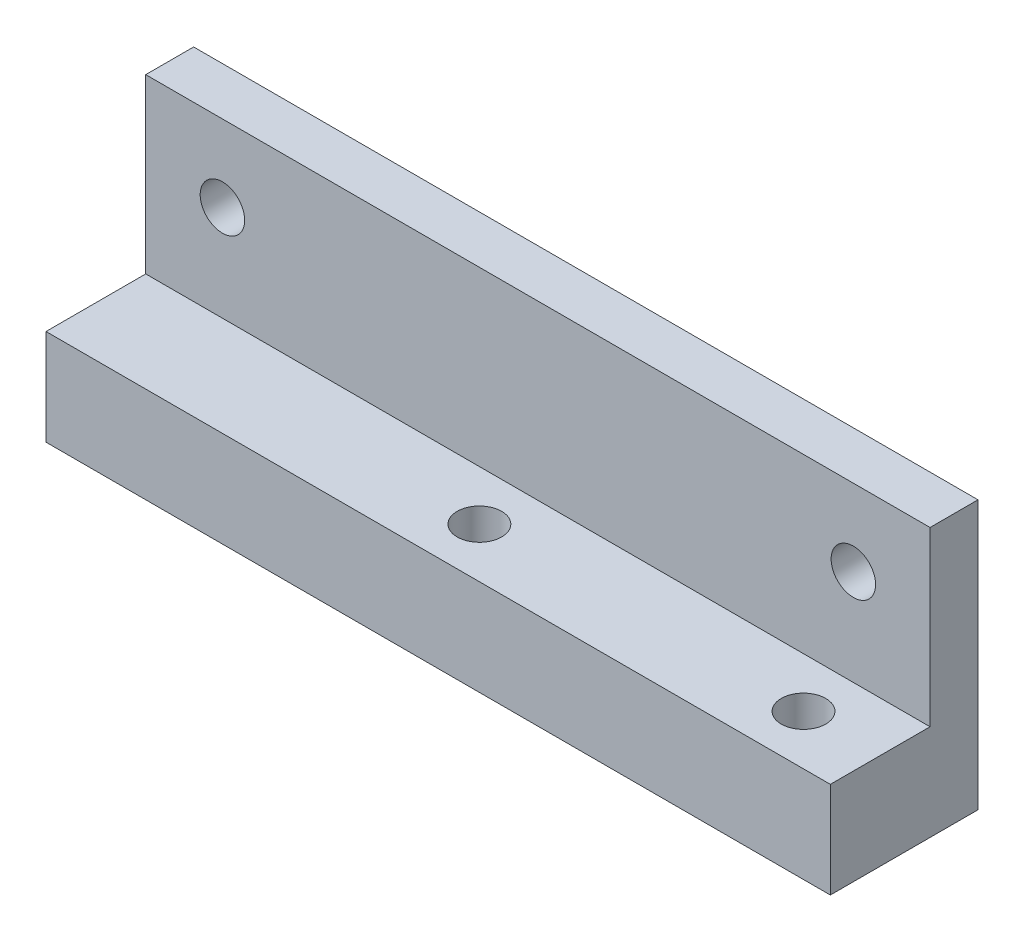
ISO-10303-21;
HEADER;
FILE_DESCRIPTION(('STEP AP214'),'2;1');
FILE_NAME('part.step','',(''),(''),'','','');
FILE_SCHEMA(('AUTOMOTIVE_DESIGN { 1 0 10303 214 1 1 1 1 }'));
ENDSEC;
DATA;
#1=APPLICATION_CONTEXT('core data for automotive mechanical design processes');
#2=APPLICATION_PROTOCOL_DEFINITION('international standard','automotive_design',2000,#1);
#3=PRODUCT_CONTEXT('',#1,'mechanical');
#4=PRODUCT('Part','Part','',(#3));
#5=PRODUCT_RELATED_PRODUCT_CATEGORY('part','',(#4));
#6=PRODUCT_DEFINITION_FORMATION('','',#4);
#7=PRODUCT_DEFINITION_CONTEXT('part definition',#1,'design');
#8=PRODUCT_DEFINITION('design','',#6,#7);
#9=PRODUCT_DEFINITION_SHAPE('','',#8);
#10=(LENGTH_UNIT() NAMED_UNIT(*) SI_UNIT(.MILLI.,.METRE.));
#11=(NAMED_UNIT(*) PLANE_ANGLE_UNIT() SI_UNIT($,.RADIAN.));
#12=(NAMED_UNIT(*) SI_UNIT($,.STERADIAN.) SOLID_ANGLE_UNIT());
#13=UNCERTAINTY_MEASURE_WITH_UNIT(LENGTH_MEASURE(1.E-05),#10,'distance_accuracy_value','');
#14=(GEOMETRIC_REPRESENTATION_CONTEXT(3) GLOBAL_UNCERTAINTY_ASSIGNED_CONTEXT((#13)) GLOBAL_UNIT_ASSIGNED_CONTEXT((#10,
#11,#12)) REPRESENTATION_CONTEXT('',''));
#15=CARTESIAN_POINT('',(0.,0.,0.));
#16=DIRECTION('',(0.,0.,1.));
#17=DIRECTION('',(1.,0.,0.));
#18=AXIS2_PLACEMENT_3D('',#15,#16,#17);
#19=CARTESIAN_POINT('',(0.,6.35,0.));
#20=DIRECTION('',(0.,-1.,0.));
#21=DIRECTION('',(0.,0.,-1.));
#22=AXIS2_PLACEMENT_3D('',#19,#20,#21);
#23=PLANE('',#22);
#24=CARTESIAN_POINT('',(25.4,6.35,-3.302));
#25=DIRECTION('',(0.,1.,0.));
#26=DIRECTION('',(0.,0.,1.));
#27=AXIS2_PLACEMENT_3D('',#24,#25,#26);
#28=CIRCLE('',#27,1.4732);
#29=CARTESIAN_POINT('',(25.4,6.35,-1.8288));
#30=VERTEX_POINT('',#29);
#31=EDGE_CURVE('E254',#30,#30,#28,.T.);
#32=ORIENTED_EDGE('',*,*,#31,.F.);
#33=EDGE_LOOP('',(#32));
#34=FACE_BOUND('',#33,.T.);
#35=CARTESIAN_POINT('',(46.863,6.35,-3.302));
#36=DIRECTION('',(0.,1.,0.));
#37=DIRECTION('',(0.,0.,1.));
#38=AXIS2_PLACEMENT_3D('',#35,#36,#37);
#39=CIRCLE('',#38,1.4732);
#40=CARTESIAN_POINT('',(46.863,6.35,-1.8288));
#41=VERTEX_POINT('',#40);
#42=EDGE_CURVE('E255',#41,#41,#39,.T.);
#43=ORIENTED_EDGE('',*,*,#42,.F.);
#44=EDGE_LOOP('',(#43));
#45=FACE_BOUND('',#44,.T.);
#46=DIRECTION('',(1.,0.,0.));
#47=VECTOR('',#46,1.);
#48=CARTESIAN_POINT('',(0.,6.35,-6.604));
#49=LINE('',#48,#47);
#50=CARTESIAN_POINT('',(0.,6.35,-6.604));
#51=VERTEX_POINT('',#50);
#52=CARTESIAN_POINT('',(51.943,6.35,-6.604));
#53=VERTEX_POINT('',#52);
#54=EDGE_CURVE('E58',#51,#53,#49,.T.);
#55=ORIENTED_EDGE('',*,*,#54,.F.);
#56=DIRECTION('',(0.,0.,1.));
#57=VECTOR('',#56,1.);
#58=CARTESIAN_POINT('',(0.,6.35,0.));
#59=LINE('',#58,#57);
#60=CARTESIAN_POINT('',(0.,6.35,0.));
#61=VERTEX_POINT('',#60);
#62=EDGE_CURVE('E95',#51,#61,#59,.T.);
#63=ORIENTED_EDGE('',*,*,#62,.T.);
#64=DIRECTION('',(1.,0.,0.));
#65=VECTOR('',#64,1.);
#66=CARTESIAN_POINT('',(0.,6.35,0.));
#67=LINE('',#66,#65);
#68=CARTESIAN_POINT('',(51.943,6.35,0.));
#69=VERTEX_POINT('',#68);
#70=EDGE_CURVE('E64',#61,#69,#67,.T.);
#71=ORIENTED_EDGE('',*,*,#70,.T.);
#72=DIRECTION('',(0.,0.,-1.));
#73=VECTOR('',#72,1.);
#74=CARTESIAN_POINT('',(51.943,6.35,0.));
#75=LINE('',#74,#73);
#76=EDGE_CURVE('E106',#69,#53,#75,.T.);
#77=ORIENTED_EDGE('',*,*,#76,.T.);
#78=EDGE_LOOP('',(#55,#63,#71,#77));
#79=FACE_BOUND('',#78,.T.);
#80=ADVANCED_FACE('F43',(#34,#45,#79),#23,.F.);
#81=CARTESIAN_POINT('',(0.,6.35,0.));
#82=DIRECTION('',(1.,0.,0.));
#83=DIRECTION('',(0.,0.,-1.));
#84=AXIS2_PLACEMENT_3D('',#81,#82,#83);
#85=PLANE('',#84);
#86=DIRECTION('',(0.,0.,1.));
#87=VECTOR('',#86,1.);
#88=CARTESIAN_POINT('',(0.,0.,0.));
#89=LINE('',#88,#87);
#90=CARTESIAN_POINT('',(0.,0.,-9.779));
#91=VERTEX_POINT('',#90);
#92=CARTESIAN_POINT('',(0.,0.,0.));
#93=VERTEX_POINT('',#92);
#94=EDGE_CURVE('E102',#91,#93,#89,.T.);
#95=ORIENTED_EDGE('',*,*,#94,.T.);
#96=DIRECTION('',(0.,-1.,0.));
#97=VECTOR('',#96,1.);
#98=CARTESIAN_POINT('',(0.,6.35,0.));
#99=LINE('',#98,#97);
#100=EDGE_CURVE('E11',#61,#93,#99,.T.);
#101=ORIENTED_EDGE('',*,*,#100,.F.);
#102=ORIENTED_EDGE('',*,*,#62,.F.);
#103=DIRECTION('',(0.,-1.,0.));
#104=VECTOR('',#103,1.);
#105=CARTESIAN_POINT('',(0.,17.78,-6.604));
#106=LINE('',#105,#104);
#107=CARTESIAN_POINT('',(0.,17.78,-6.604));
#108=VERTEX_POINT('',#107);
#109=EDGE_CURVE('E110',#108,#51,#106,.T.);
#110=ORIENTED_EDGE('',*,*,#109,.F.);
#111=DIRECTION('',(0.,0.,1.));
#112=VECTOR('',#111,1.);
#113=CARTESIAN_POINT('',(0.,17.78,-9.779));
#114=LINE('',#113,#112);
#115=CARTESIAN_POINT('',(0.,17.78,-9.779));
#116=VERTEX_POINT('',#115);
#117=EDGE_CURVE('E105',#116,#108,#114,.T.);
#118=ORIENTED_EDGE('',*,*,#117,.F.);
#119=DIRECTION('',(0.,-1.,0.));
#120=VECTOR('',#119,1.);
#121=CARTESIAN_POINT('',(0.,6.35,-9.779));
#122=LINE('',#121,#120);
#123=EDGE_CURVE('E88',#116,#91,#122,.T.);
#124=ORIENTED_EDGE('',*,*,#123,.T.);
#125=EDGE_LOOP('',(#95,#101,#102,#110,#118,#124));
#126=FACE_BOUND('',#125,.T.);
#127=ADVANCED_FACE('F45',(#126),#85,.F.);
#128=CARTESIAN_POINT('',(0.,6.35,0.));
#129=DIRECTION('',(0.,0.,-1.));
#130=DIRECTION('',(-1.,0.,0.));
#131=AXIS2_PLACEMENT_3D('',#128,#129,#130);
#132=PLANE('',#131);
#133=DIRECTION('',(1.,0.,0.));
#134=VECTOR('',#133,1.);
#135=CARTESIAN_POINT('',(0.,0.,0.));
#136=LINE('',#135,#134);
#137=CARTESIAN_POINT('',(51.943,0.,0.));
#138=VERTEX_POINT('',#137);
#139=EDGE_CURVE('E109',#93,#138,#136,.T.);
#140=ORIENTED_EDGE('',*,*,#139,.T.);
#141=DIRECTION('',(0.,-1.,0.));
#142=VECTOR('',#141,1.);
#143=CARTESIAN_POINT('',(51.943,6.35,0.));
#144=LINE('',#143,#142);
#145=EDGE_CURVE('E51',#69,#138,#144,.T.);
#146=ORIENTED_EDGE('',*,*,#145,.F.);
#147=ORIENTED_EDGE('',*,*,#70,.F.);
#148=ORIENTED_EDGE('',*,*,#100,.T.);
#149=EDGE_LOOP('',(#140,#146,#147,#148));
#150=FACE_BOUND('',#149,.T.);
#151=ADVANCED_FACE('F126',(#150),#132,.F.);
#152=CARTESIAN_POINT('',(51.943,6.35,0.));
#153=DIRECTION('',(-1.,0.,0.));
#154=DIRECTION('',(0.,0.,1.));
#155=AXIS2_PLACEMENT_3D('',#152,#153,#154);
#156=PLANE('',#155);
#157=DIRECTION('',(0.,0.,-1.));
#158=VECTOR('',#157,1.);
#159=CARTESIAN_POINT('',(51.943,0.,0.));
#160=LINE('',#159,#158);
#161=CARTESIAN_POINT('',(51.943,0.,-9.779));
#162=VERTEX_POINT('',#161);
#163=EDGE_CURVE('E96',#138,#162,#160,.T.);
#164=ORIENTED_EDGE('',*,*,#163,.T.);
#165=DIRECTION('',(0.,-1.,0.));
#166=VECTOR('',#165,1.);
#167=CARTESIAN_POINT('',(51.943,6.35,-9.779));
#168=LINE('',#167,#166);
#169=CARTESIAN_POINT('',(51.943,17.78,-9.779));
#170=VERTEX_POINT('',#169);
#171=EDGE_CURVE('E91',#170,#162,#168,.T.);
#172=ORIENTED_EDGE('',*,*,#171,.F.);
#173=DIRECTION('',(0.,0.,-1.));
#174=VECTOR('',#173,1.);
#175=CARTESIAN_POINT('',(51.943,17.78,-9.779));
#176=LINE('',#175,#174);
#177=CARTESIAN_POINT('',(51.943,17.78,-6.604));
#178=VERTEX_POINT('',#177);
#179=EDGE_CURVE('E141',#178,#170,#176,.T.);
#180=ORIENTED_EDGE('',*,*,#179,.F.);
#181=DIRECTION('',(0.,-1.,0.));
#182=VECTOR('',#181,1.);
#183=CARTESIAN_POINT('',(51.943,17.78,-6.604));
#184=LINE('',#183,#182);
#185=EDGE_CURVE('E114',#178,#53,#184,.T.);
#186=ORIENTED_EDGE('',*,*,#185,.T.);
#187=ORIENTED_EDGE('',*,*,#76,.F.);
#188=ORIENTED_EDGE('',*,*,#145,.T.);
#189=EDGE_LOOP('',(#164,#172,#180,#186,#187,#188));
#190=FACE_BOUND('',#189,.T.);
#191=ADVANCED_FACE('F123',(#190),#156,.F.);
#192=CARTESIAN_POINT('',(0.,6.35,-9.779));
#193=DIRECTION('',(0.,0.,1.));
#194=DIRECTION('',(1.,0.,0.));
#195=AXIS2_PLACEMENT_3D('',#192,#193,#194);
#196=PLANE('',#195);
#197=CARTESIAN_POINT('',(46.863,12.7,-9.779));
#198=DIRECTION('',(0.,0.,1.));
#199=DIRECTION('',(1.,0.,0.));
#200=AXIS2_PLACEMENT_3D('',#197,#198,#199);
#201=CIRCLE('',#200,1.4732);
#202=CARTESIAN_POINT('',(48.3362,12.7,-9.779));
#203=VERTEX_POINT('',#202);
#204=EDGE_CURVE('E146',#203,#203,#201,.T.);
#205=ORIENTED_EDGE('',*,*,#204,.T.);
#206=EDGE_LOOP('',(#205));
#207=FACE_BOUND('',#206,.T.);
#208=CARTESIAN_POINT('',(5.08,12.7,-9.779));
#209=DIRECTION('',(0.,0.,1.));
#210=DIRECTION('',(1.,0.,0.));
#211=AXIS2_PLACEMENT_3D('',#208,#209,#210);
#212=CIRCLE('',#211,1.4732);
#213=CARTESIAN_POINT('',(6.5532,12.7,-9.779));
#214=VERTEX_POINT('',#213);
#215=EDGE_CURVE('E268',#214,#214,#212,.T.);
#216=ORIENTED_EDGE('',*,*,#215,.T.);
#217=EDGE_LOOP('',(#216));
#218=FACE_BOUND('',#217,.T.);
#219=DIRECTION('',(-1.,0.,0.));
#220=VECTOR('',#219,1.);
#221=CARTESIAN_POINT('',(0.,0.,-9.779));
#222=LINE('',#221,#220);
#223=EDGE_CURVE('E84',#162,#91,#222,.T.);
#224=ORIENTED_EDGE('',*,*,#223,.T.);
#225=ORIENTED_EDGE('',*,*,#123,.F.);
#226=DIRECTION('',(-1.,0.,0.));
#227=VECTOR('',#226,1.);
#228=CARTESIAN_POINT('',(0.,17.78,-9.779));
#229=LINE('',#228,#227);
#230=EDGE_CURVE('E144',#170,#116,#229,.T.);
#231=ORIENTED_EDGE('',*,*,#230,.F.);
#232=ORIENTED_EDGE('',*,*,#171,.T.);
#233=EDGE_LOOP('',(#224,#225,#231,#232));
#234=FACE_BOUND('',#233,.T.);
#235=ADVANCED_FACE('F86',(#207,#218,#234),#196,.F.);
#236=CARTESIAN_POINT('',(0.,0.,0.));
#237=DIRECTION('',(0.,-1.,0.));
#238=DIRECTION('',(0.,0.,-1.));
#239=AXIS2_PLACEMENT_3D('',#236,#237,#238);
#240=PLANE('',#239);
#241=CARTESIAN_POINT('',(25.4,0.,-3.302));
#242=DIRECTION('',(0.,1.,0.));
#243=DIRECTION('',(0.,0.,1.));
#244=AXIS2_PLACEMENT_3D('',#241,#242,#243);
#245=CIRCLE('',#244,1.4732);
#246=CARTESIAN_POINT('',(25.4,0.,-1.8288));
#247=VERTEX_POINT('',#246);
#248=EDGE_CURVE('E252',#247,#247,#245,.T.);
#249=ORIENTED_EDGE('',*,*,#248,.T.);
#250=EDGE_LOOP('',(#249));
#251=FACE_BOUND('',#250,.T.);
#252=CARTESIAN_POINT('',(46.863,0.,-3.302));
#253=DIRECTION('',(0.,1.,0.));
#254=DIRECTION('',(0.,0.,1.));
#255=AXIS2_PLACEMENT_3D('',#252,#253,#254);
#256=CIRCLE('',#255,1.4732);
#257=CARTESIAN_POINT('',(46.863,0.,-1.8288));
#258=VERTEX_POINT('',#257);
#259=EDGE_CURVE('E260',#258,#258,#256,.T.);
#260=ORIENTED_EDGE('',*,*,#259,.T.);
#261=EDGE_LOOP('',(#260));
#262=FACE_BOUND('',#261,.T.);
#263=ORIENTED_EDGE('',*,*,#94,.F.);
#264=ORIENTED_EDGE('',*,*,#223,.F.);
#265=ORIENTED_EDGE('',*,*,#163,.F.);
#266=ORIENTED_EDGE('',*,*,#139,.F.);
#267=EDGE_LOOP('',(#263,#264,#265,#266));
#268=FACE_BOUND('',#267,.T.);
#269=ADVANCED_FACE('F108',(#251,#262,#268),#240,.T.);
#270=CARTESIAN_POINT('',(0.,17.78,-6.604));
#271=DIRECTION('',(0.,0.,-1.));
#272=DIRECTION('',(-1.,0.,0.));
#273=AXIS2_PLACEMENT_3D('',#270,#271,#272);
#274=PLANE('',#273);
#275=CARTESIAN_POINT('',(46.863,12.7,-6.604));
#276=DIRECTION('',(0.,0.,1.));
#277=DIRECTION('',(1.,0.,0.));
#278=AXIS2_PLACEMENT_3D('',#275,#276,#277);
#279=CIRCLE('',#278,1.4732);
#280=CARTESIAN_POINT('',(48.3362,12.7,-6.604));
#281=VERTEX_POINT('',#280);
#282=EDGE_CURVE('E265',#281,#281,#279,.T.);
#283=ORIENTED_EDGE('',*,*,#282,.F.);
#284=EDGE_LOOP('',(#283));
#285=FACE_BOUND('',#284,.T.);
#286=CARTESIAN_POINT('',(5.08,12.7,-6.604));
#287=DIRECTION('',(0.,0.,1.));
#288=DIRECTION('',(1.,0.,0.));
#289=AXIS2_PLACEMENT_3D('',#286,#287,#288);
#290=CIRCLE('',#289,1.4732);
#291=CARTESIAN_POINT('',(6.5532,12.7,-6.604));
#292=VERTEX_POINT('',#291);
#293=EDGE_CURVE('E257',#292,#292,#290,.T.);
#294=ORIENTED_EDGE('',*,*,#293,.F.);
#295=EDGE_LOOP('',(#294));
#296=FACE_BOUND('',#295,.T.);
#297=ORIENTED_EDGE('',*,*,#54,.T.);
#298=ORIENTED_EDGE('',*,*,#185,.F.);
#299=DIRECTION('',(1.,0.,0.));
#300=VECTOR('',#299,1.);
#301=CARTESIAN_POINT('',(0.,17.78,-6.604));
#302=LINE('',#301,#300);
#303=EDGE_CURVE('E135',#108,#178,#302,.T.);
#304=ORIENTED_EDGE('',*,*,#303,.F.);
#305=ORIENTED_EDGE('',*,*,#109,.T.);
#306=EDGE_LOOP('',(#297,#298,#304,#305));
#307=FACE_BOUND('',#306,.T.);
#308=ADVANCED_FACE('F131',(#285,#296,#307),#274,.F.);
#309=CARTESIAN_POINT('',(0.,17.78,0.));
#310=DIRECTION('',(0.,1.,0.));
#311=DIRECTION('',(0.,0.,1.));
#312=AXIS2_PLACEMENT_3D('',#309,#310,#311);
#313=PLANE('',#312);
#314=ORIENTED_EDGE('',*,*,#117,.T.);
#315=ORIENTED_EDGE('',*,*,#303,.T.);
#316=ORIENTED_EDGE('',*,*,#179,.T.);
#317=ORIENTED_EDGE('',*,*,#230,.T.);
#318=EDGE_LOOP('',(#314,#315,#316,#317));
#319=FACE_BOUND('',#318,.T.);
#320=ADVANCED_FACE('F143',(#319),#313,.T.);
#321=CARTESIAN_POINT('',(5.08,12.7,-12.954));
#322=DIRECTION('',(0.,0.,1.));
#323=DIRECTION('',(1.,0.,0.));
#324=AXIS2_PLACEMENT_3D('',#321,#322,#323);
#325=CYLINDRICAL_SURFACE('',#324,1.4732);
#326=ORIENTED_EDGE('',*,*,#293,.T.);
#327=EDGE_LOOP('',(#326));
#328=FACE_BOUND('',#327,.T.);
#329=ORIENTED_EDGE('',*,*,#215,.F.);
#330=EDGE_LOOP('',(#329));
#331=FACE_BOUND('',#330,.T.);
#332=ADVANCED_FACE('F197',(#328,#331),#325,.F.);
#333=CARTESIAN_POINT('',(46.863,12.7,-12.954));
#334=DIRECTION('',(0.,0.,1.));
#335=DIRECTION('',(1.,0.,0.));
#336=AXIS2_PLACEMENT_3D('',#333,#334,#335);
#337=CYLINDRICAL_SURFACE('',#336,1.4732);
#338=ORIENTED_EDGE('',*,*,#282,.T.);
#339=EDGE_LOOP('',(#338));
#340=FACE_BOUND('',#339,.T.);
#341=ORIENTED_EDGE('',*,*,#204,.F.);
#342=EDGE_LOOP('',(#341));
#343=FACE_BOUND('',#342,.T.);
#344=ADVANCED_FACE('F215',(#340,#343),#337,.F.);
#345=CARTESIAN_POINT('',(46.863,0.,-3.302));
#346=DIRECTION('',(0.,1.,0.));
#347=DIRECTION('',(0.,0.,1.));
#348=AXIS2_PLACEMENT_3D('',#345,#346,#347);
#349=CYLINDRICAL_SURFACE('',#348,1.4732);
#350=ORIENTED_EDGE('',*,*,#259,.F.);
#351=EDGE_LOOP('',(#350));
#352=FACE_BOUND('',#351,.T.);
#353=ORIENTED_EDGE('',*,*,#42,.T.);
#354=EDGE_LOOP('',(#353));
#355=FACE_BOUND('',#354,.T.);
#356=ADVANCED_FACE('F223',(#352,#355),#349,.F.);
#357=CARTESIAN_POINT('',(25.4,0.,-3.302));
#358=DIRECTION('',(0.,1.,0.));
#359=DIRECTION('',(0.,0.,1.));
#360=AXIS2_PLACEMENT_3D('',#357,#358,#359);
#361=CYLINDRICAL_SURFACE('',#360,1.4732);
#362=ORIENTED_EDGE('',*,*,#248,.F.);
#363=EDGE_LOOP('',(#362));
#364=FACE_BOUND('',#363,.T.);
#365=ORIENTED_EDGE('',*,*,#31,.T.);
#366=EDGE_LOOP('',(#365));
#367=FACE_BOUND('',#366,.T.);
#368=ADVANCED_FACE('F236',(#364,#367),#361,.F.);
#369=CLOSED_SHELL('',(#80,#127,#151,#191,#235,#269,#308,#320,#332,#344,#356,#368));
#370=MANIFOLD_SOLID_BREP('B2',#369);
#371=ADVANCED_BREP_SHAPE_REPRESENTATION('',(#18,#370),#14);
#372=SHAPE_DEFINITION_REPRESENTATION(#9,#371);
ENDSEC;
END-ISO-10303-21;
